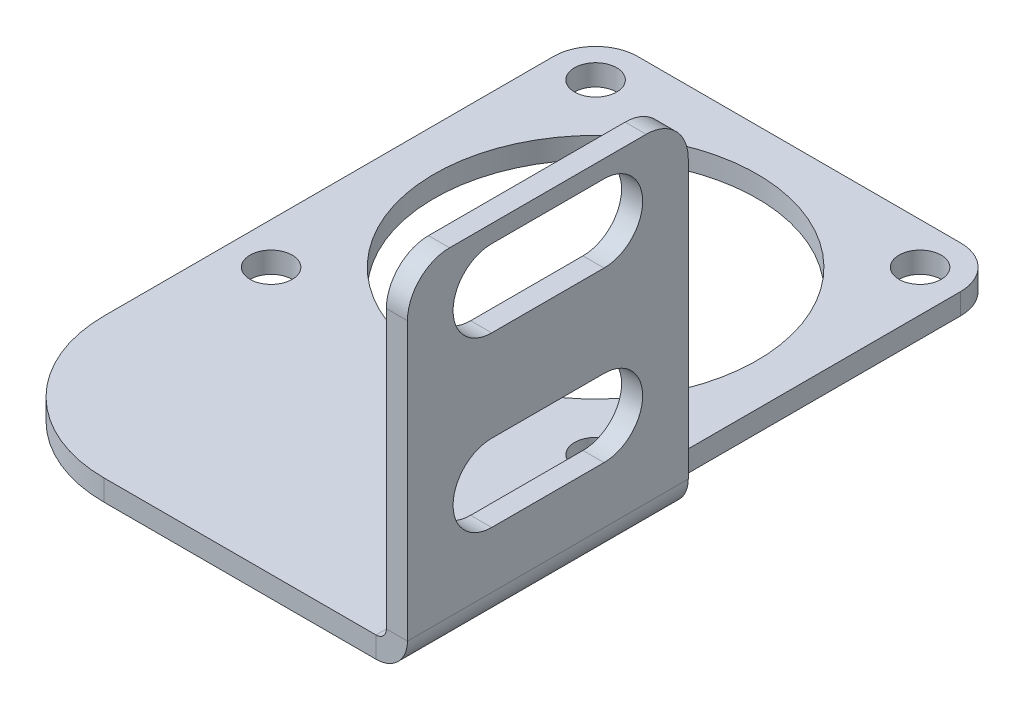
ISO-10303-21;
HEADER;
FILE_DESCRIPTION(('STEP AP214'),'2;1');
FILE_NAME('part.step','',(''),(''),'','','');
FILE_SCHEMA(('AUTOMOTIVE_DESIGN { 1 0 10303 214 1 1 1 1 }'));
ENDSEC;
DATA;
#1=APPLICATION_CONTEXT('core data for automotive mechanical design processes');
#2=APPLICATION_PROTOCOL_DEFINITION('international standard','automotive_design',2000,#1);
#3=PRODUCT_CONTEXT('',#1,'mechanical');
#4=PRODUCT('Part','Part','',(#3));
#5=PRODUCT_RELATED_PRODUCT_CATEGORY('part','',(#4));
#6=PRODUCT_DEFINITION_FORMATION('','',#4);
#7=PRODUCT_DEFINITION_CONTEXT('part definition',#1,'design');
#8=PRODUCT_DEFINITION('design','',#6,#7);
#9=PRODUCT_DEFINITION_SHAPE('','',#8);
#10=(LENGTH_UNIT() NAMED_UNIT(*) SI_UNIT(.MILLI.,.METRE.));
#11=(NAMED_UNIT(*) PLANE_ANGLE_UNIT() SI_UNIT($,.RADIAN.));
#12=(NAMED_UNIT(*) SI_UNIT($,.STERADIAN.) SOLID_ANGLE_UNIT());
#13=UNCERTAINTY_MEASURE_WITH_UNIT(LENGTH_MEASURE(1.E-05),#10,'distance_accuracy_value','');
#14=(GEOMETRIC_REPRESENTATION_CONTEXT(3) GLOBAL_UNCERTAINTY_ASSIGNED_CONTEXT((#13)) GLOBAL_UNIT_ASSIGNED_CONTEXT((#10,
#11,#12)) REPRESENTATION_CONTEXT('',''));
#15=CARTESIAN_POINT('',(0.,0.,0.));
#16=DIRECTION('',(0.,0.,1.));
#17=DIRECTION('',(1.,0.,0.));
#18=AXIS2_PLACEMENT_3D('',#15,#16,#17);
#19=CARTESIAN_POINT('',(-14.5,22.25,8.5));
#20=DIRECTION('',(0.,1.,0.));
#21=DIRECTION('',(1.,0.,0.));
#22=AXIS2_PLACEMENT_3D('',#19,#20,#21);
#23=PLANE('',#22);
#24=DIRECTION('',(0.,0.,-1.));
#25=VECTOR('',#24,1.);
#26=CARTESIAN_POINT('',(15.6,22.25,0.));
#27=LINE('',#26,#25);
#28=CARTESIAN_POINT('',(15.6,22.25,16.5));
#29=VERTEX_POINT('',#28);
#30=CARTESIAN_POINT('',(15.6,22.25,8.5));
#31=VERTEX_POINT('',#30);
#32=EDGE_CURVE('E114',#29,#31,#27,.T.);
#33=ORIENTED_EDGE('',*,*,#32,.T.);
#34=DIRECTION('',(1.,0.,0.));
#35=VECTOR('',#34,1.);
#36=CARTESIAN_POINT('',(-14.5,22.25,8.5));
#37=LINE('',#36,#35);
#38=CARTESIAN_POINT('',(17.1,22.25,8.5));
#39=VERTEX_POINT('',#38);
#40=EDGE_CURVE('E133',#31,#39,#37,.T.);
#41=ORIENTED_EDGE('',*,*,#40,.T.);
#42=DIRECTION('',(0.,0.,1.));
#43=VECTOR('',#42,1.);
#44=CARTESIAN_POINT('',(17.1,22.25,8.5));
#45=LINE('',#44,#43);
#46=CARTESIAN_POINT('',(17.1,22.25,16.5));
#47=VERTEX_POINT('',#46);
#48=EDGE_CURVE('E325',#39,#47,#45,.T.);
#49=ORIENTED_EDGE('',*,*,#48,.T.);
#50=DIRECTION('',(1.,0.,0.));
#51=VECTOR('',#50,1.);
#52=CARTESIAN_POINT('',(-14.5,22.25,16.5));
#53=LINE('',#52,#51);
#54=EDGE_CURVE('E11',#29,#47,#53,.T.);
#55=ORIENTED_EDGE('',*,*,#54,.F.);
#56=EDGE_LOOP('',(#33,#41,#49,#55));
#57=FACE_BOUND('',#56,.T.);
#58=ADVANCED_FACE('F17',(#57),#23,.F.);
#59=CARTESIAN_POINT('',(-14.5,19.5,16.5));
#60=DIRECTION('',(1.,0.,0.));
#61=DIRECTION('',(0.,1.,0.));
#62=AXIS2_PLACEMENT_3D('',#59,#60,#61);
#63=CYLINDRICAL_SURFACE('',#62,2.75);
#64=CARTESIAN_POINT('',(15.6,19.5,16.5));
#65=DIRECTION('',(-1.,0.,0.));
#66=DIRECTION('',(0.,-1.,0.));
#67=AXIS2_PLACEMENT_3D('',#64,#65,#66);
#68=CIRCLE('',#67,2.75);
#69=CARTESIAN_POINT('',(15.6,16.75,16.5));
#70=VERTEX_POINT('',#69);
#71=EDGE_CURVE('E111',#70,#29,#68,.T.);
#72=ORIENTED_EDGE('',*,*,#71,.T.);
#73=ORIENTED_EDGE('',*,*,#54,.T.);
#74=CARTESIAN_POINT('',(17.1,19.5,16.5));
#75=DIRECTION('',(1.,0.,0.));
#76=DIRECTION('',(0.,1.,0.));
#77=AXIS2_PLACEMENT_3D('',#74,#75,#76);
#78=CIRCLE('',#77,2.75);
#79=CARTESIAN_POINT('',(17.1,16.75,16.5));
#80=VERTEX_POINT('',#79);
#81=EDGE_CURVE('E205',#47,#80,#78,.T.);
#82=ORIENTED_EDGE('',*,*,#81,.T.);
#83=DIRECTION('',(1.,0.,0.));
#84=VECTOR('',#83,1.);
#85=CARTESIAN_POINT('',(-14.5,16.75,16.5));
#86=LINE('',#85,#84);
#87=EDGE_CURVE('E21',#70,#80,#86,.T.);
#88=ORIENTED_EDGE('',*,*,#87,.F.);
#89=EDGE_LOOP('',(#72,#73,#82,#88));
#90=FACE_BOUND('',#89,.T.);
#91=ADVANCED_FACE('F19',(#90),#63,.F.);
#92=CARTESIAN_POINT('',(-14.5,16.75,8.5));
#93=DIRECTION('',(0.,-1.,0.));
#94=DIRECTION('',(-1.,0.,0.));
#95=AXIS2_PLACEMENT_3D('',#92,#93,#94);
#96=PLANE('',#95);
#97=DIRECTION('',(0.,0.,1.));
#98=VECTOR('',#97,1.);
#99=CARTESIAN_POINT('',(15.6,16.75,0.));
#100=LINE('',#99,#98);
#101=CARTESIAN_POINT('',(15.6,16.75,8.5));
#102=VERTEX_POINT('',#101);
#103=EDGE_CURVE('E102',#102,#70,#100,.T.);
#104=ORIENTED_EDGE('',*,*,#103,.T.);
#105=ORIENTED_EDGE('',*,*,#87,.T.);
#106=DIRECTION('',(0.,0.,-1.));
#107=VECTOR('',#106,1.);
#108=CARTESIAN_POINT('',(17.1,16.75,8.5));
#109=LINE('',#108,#107);
#110=CARTESIAN_POINT('',(17.1,16.75,8.5));
#111=VERTEX_POINT('',#110);
#112=EDGE_CURVE('E202',#80,#111,#109,.T.);
#113=ORIENTED_EDGE('',*,*,#112,.T.);
#114=DIRECTION('',(1.,0.,0.));
#115=VECTOR('',#114,1.);
#116=CARTESIAN_POINT('',(-14.5,16.75,8.5));
#117=LINE('',#116,#115);
#118=EDGE_CURVE('E126',#102,#111,#117,.T.);
#119=ORIENTED_EDGE('',*,*,#118,.F.);
#120=EDGE_LOOP('',(#104,#105,#113,#119));
#121=FACE_BOUND('',#120,.T.);
#122=ADVANCED_FACE('F518',(#121),#96,.F.);
#123=CARTESIAN_POINT('',(-14.5,19.5,8.5));
#124=DIRECTION('',(1.,0.,0.));
#125=DIRECTION('',(0.,1.,0.));
#126=AXIS2_PLACEMENT_3D('',#123,#124,#125);
#127=CYLINDRICAL_SURFACE('',#126,2.75);
#128=CARTESIAN_POINT('',(15.6,19.5,8.5));
#129=DIRECTION('',(-1.,0.,0.));
#130=DIRECTION('',(0.,-1.,0.));
#131=AXIS2_PLACEMENT_3D('',#128,#129,#130);
#132=CIRCLE('',#131,2.75);
#133=EDGE_CURVE('E384',#31,#102,#132,.T.);
#134=ORIENTED_EDGE('',*,*,#133,.T.);
#135=ORIENTED_EDGE('',*,*,#118,.T.);
#136=CARTESIAN_POINT('',(17.1,19.5,8.5));
#137=DIRECTION('',(1.,0.,0.));
#138=DIRECTION('',(0.,1.,0.));
#139=AXIS2_PLACEMENT_3D('',#136,#137,#138);
#140=CIRCLE('',#139,2.75);
#141=EDGE_CURVE('E206',#111,#39,#140,.T.);
#142=ORIENTED_EDGE('',*,*,#141,.T.);
#143=ORIENTED_EDGE('',*,*,#40,.F.);
#144=EDGE_LOOP('',(#134,#135,#142,#143));
#145=FACE_BOUND('',#144,.T.);
#146=ADVANCED_FACE('F509',(#145),#127,.F.);
#147=CARTESIAN_POINT('',(-14.5,10.25,8.5));
#148=DIRECTION('',(0.,1.,0.));
#149=DIRECTION('',(1.,0.,0.));
#150=AXIS2_PLACEMENT_3D('',#147,#148,#149);
#151=PLANE('',#150);
#152=DIRECTION('',(0.,0.,-1.));
#153=VECTOR('',#152,1.);
#154=CARTESIAN_POINT('',(15.6,10.25,0.));
#155=LINE('',#154,#153);
#156=CARTESIAN_POINT('',(15.6,10.25,16.5));
#157=VERTEX_POINT('',#156);
#158=CARTESIAN_POINT('',(15.6,10.25,8.5));
#159=VERTEX_POINT('',#158);
#160=EDGE_CURVE('E101',#157,#159,#155,.T.);
#161=ORIENTED_EDGE('',*,*,#160,.T.);
#162=DIRECTION('',(1.,0.,0.));
#163=VECTOR('',#162,1.);
#164=CARTESIAN_POINT('',(-14.5,10.25,8.5));
#165=LINE('',#164,#163);
#166=CARTESIAN_POINT('',(17.1,10.25,8.5));
#167=VERTEX_POINT('',#166);
#168=EDGE_CURVE('E68',#159,#167,#165,.T.);
#169=ORIENTED_EDGE('',*,*,#168,.T.);
#170=DIRECTION('',(0.,0.,1.));
#171=VECTOR('',#170,1.);
#172=CARTESIAN_POINT('',(17.1,10.25,8.5));
#173=LINE('',#172,#171);
#174=CARTESIAN_POINT('',(17.1,10.25,16.5));
#175=VERTEX_POINT('',#174);
#176=EDGE_CURVE('E243',#167,#175,#173,.T.);
#177=ORIENTED_EDGE('',*,*,#176,.T.);
#178=DIRECTION('',(1.,0.,0.));
#179=VECTOR('',#178,1.);
#180=CARTESIAN_POINT('',(-14.5,10.25,16.5));
#181=LINE('',#180,#179);
#182=EDGE_CURVE('E123',#157,#175,#181,.T.);
#183=ORIENTED_EDGE('',*,*,#182,.F.);
#184=EDGE_LOOP('',(#161,#169,#177,#183));
#185=FACE_BOUND('',#184,.T.);
#186=ADVANCED_FACE('F693',(#185),#151,.F.);
#187=CARTESIAN_POINT('',(-14.5,7.5000000000001,16.5));
#188=DIRECTION('',(1.,0.,0.));
#189=DIRECTION('',(0.,1.,0.));
#190=AXIS2_PLACEMENT_3D('',#187,#188,#189);
#191=CYLINDRICAL_SURFACE('',#190,2.75);
#192=CARTESIAN_POINT('',(15.6,7.5,16.5));
#193=DIRECTION('',(-1.,0.,0.));
#194=DIRECTION('',(0.,-1.,0.));
#195=AXIS2_PLACEMENT_3D('',#192,#193,#194);
#196=CIRCLE('',#195,2.75);
#197=CARTESIAN_POINT('',(15.6,4.75,16.5));
#198=VERTEX_POINT('',#197);
#199=EDGE_CURVE('E95',#198,#157,#196,.T.);
#200=ORIENTED_EDGE('',*,*,#199,.T.);
#201=ORIENTED_EDGE('',*,*,#182,.T.);
#202=CARTESIAN_POINT('',(17.1,7.5,16.5));
#203=DIRECTION('',(1.,0.,0.));
#204=DIRECTION('',(0.,1.,0.));
#205=AXIS2_PLACEMENT_3D('',#202,#203,#204);
#206=CIRCLE('',#205,2.75);
#207=CARTESIAN_POINT('',(17.1,4.75,16.5));
#208=VERTEX_POINT('',#207);
#209=EDGE_CURVE('E215',#175,#208,#206,.T.);
#210=ORIENTED_EDGE('',*,*,#209,.T.);
#211=DIRECTION('',(1.,0.,0.));
#212=VECTOR('',#211,1.);
#213=CARTESIAN_POINT('',(-14.5,4.7500000000001,16.5));
#214=LINE('',#213,#212);
#215=EDGE_CURVE('E42',#198,#208,#214,.T.);
#216=ORIENTED_EDGE('',*,*,#215,.F.);
#217=EDGE_LOOP('',(#200,#201,#210,#216));
#218=FACE_BOUND('',#217,.T.);
#219=ADVANCED_FACE('F690',(#218),#191,.F.);
#220=CARTESIAN_POINT('',(-14.5,4.7500000000001,8.5));
#221=DIRECTION('',(0.,-1.,0.));
#222=DIRECTION('',(-1.,0.,0.));
#223=AXIS2_PLACEMENT_3D('',#220,#221,#222);
#224=PLANE('',#223);
#225=DIRECTION('',(0.,0.,1.));
#226=VECTOR('',#225,1.);
#227=CARTESIAN_POINT('',(15.6,4.75,0.));
#228=LINE('',#227,#226);
#229=CARTESIAN_POINT('',(15.6,4.75,8.5));
#230=VERTEX_POINT('',#229);
#231=EDGE_CURVE('E80',#230,#198,#228,.T.);
#232=ORIENTED_EDGE('',*,*,#231,.T.);
#233=ORIENTED_EDGE('',*,*,#215,.T.);
#234=DIRECTION('',(0.,0.,-1.));
#235=VECTOR('',#234,1.);
#236=CARTESIAN_POINT('',(17.1,4.75,8.5));
#237=LINE('',#236,#235);
#238=CARTESIAN_POINT('',(17.1,4.75,8.5));
#239=VERTEX_POINT('',#238);
#240=EDGE_CURVE('E84',#208,#239,#237,.T.);
#241=ORIENTED_EDGE('',*,*,#240,.T.);
#242=DIRECTION('',(1.,0.,0.));
#243=VECTOR('',#242,1.);
#244=CARTESIAN_POINT('',(-14.5,4.7500000000001,8.5));
#245=LINE('',#244,#243);
#246=EDGE_CURVE('E77',#230,#239,#245,.T.);
#247=ORIENTED_EDGE('',*,*,#246,.F.);
#248=EDGE_LOOP('',(#232,#233,#241,#247));
#249=FACE_BOUND('',#248,.T.);
#250=ADVANCED_FACE('F79',(#249),#224,.F.);
#251=CARTESIAN_POINT('',(-14.5,7.5000000000001,8.5));
#252=DIRECTION('',(1.,0.,0.));
#253=DIRECTION('',(0.,1.,0.));
#254=AXIS2_PLACEMENT_3D('',#251,#252,#253);
#255=CYLINDRICAL_SURFACE('',#254,2.75);
#256=CARTESIAN_POINT('',(15.6,7.5,8.5));
#257=DIRECTION('',(-1.,0.,0.));
#258=DIRECTION('',(0.,-1.,0.));
#259=AXIS2_PLACEMENT_3D('',#256,#257,#258);
#260=CIRCLE('',#259,2.75);
#261=EDGE_CURVE('E94',#159,#230,#260,.T.);
#262=ORIENTED_EDGE('',*,*,#261,.T.);
#263=ORIENTED_EDGE('',*,*,#246,.T.);
#264=CARTESIAN_POINT('',(17.1,7.5,8.5));
#265=DIRECTION('',(1.,0.,0.));
#266=DIRECTION('',(0.,1.,0.));
#267=AXIS2_PLACEMENT_3D('',#264,#265,#266);
#268=CIRCLE('',#267,2.75);
#269=EDGE_CURVE('E320',#239,#167,#268,.T.);
#270=ORIENTED_EDGE('',*,*,#269,.T.);
#271=ORIENTED_EDGE('',*,*,#168,.F.);
#272=EDGE_LOOP('',(#262,#263,#270,#271));
#273=FACE_BOUND('',#272,.T.);
#274=ADVANCED_FACE('F99',(#273),#255,.F.);
#275=CARTESIAN_POINT('',(17.1,20.5,19.5));
#276=DIRECTION('',(-1.,0.,0.));
#277=DIRECTION('',(0.,-1.,0.));
#278=AXIS2_PLACEMENT_3D('',#275,#276,#277);
#279=CYLINDRICAL_SURFACE('',#278,3.);
#280=CARTESIAN_POINT('',(17.1,20.5,19.5));
#281=DIRECTION('',(1.,0.,0.));
#282=DIRECTION('',(0.,-1.,0.));
#283=AXIS2_PLACEMENT_3D('',#280,#281,#282);
#284=CIRCLE('',#283,3.);
#285=CARTESIAN_POINT('',(17.1,23.5,19.5));
#286=VERTEX_POINT('',#285);
#287=CARTESIAN_POINT('',(17.1,20.5,22.5));
#288=VERTEX_POINT('',#287);
#289=EDGE_CURVE('E321',#286,#288,#284,.T.);
#290=ORIENTED_EDGE('',*,*,#289,.F.);
#291=DIRECTION('',(1.,0.,0.));
#292=VECTOR('',#291,1.);
#293=CARTESIAN_POINT('',(17.1,23.5,19.5));
#294=LINE('',#293,#292);
#295=CARTESIAN_POINT('',(15.6,23.5,19.5));
#296=VERTEX_POINT('',#295);
#297=EDGE_CURVE('E87',#296,#286,#294,.T.);
#298=ORIENTED_EDGE('',*,*,#297,.F.);
#299=CARTESIAN_POINT('',(15.6,20.5,19.5));
#300=DIRECTION('',(-1.,0.,0.));
#301=DIRECTION('',(0.,-1.,0.));
#302=AXIS2_PLACEMENT_3D('',#299,#300,#301);
#303=CIRCLE('',#302,3.);
#304=CARTESIAN_POINT('',(15.6,20.5,22.5));
#305=VERTEX_POINT('',#304);
#306=EDGE_CURVE('E381',#305,#296,#303,.T.);
#307=ORIENTED_EDGE('',*,*,#306,.F.);
#308=DIRECTION('',(-1.,0.,0.));
#309=VECTOR('',#308,1.);
#310=CARTESIAN_POINT('',(17.1,20.5,22.5));
#311=LINE('',#310,#309);
#312=EDGE_CURVE('E299',#288,#305,#311,.T.);
#313=ORIENTED_EDGE('',*,*,#312,.F.);
#314=EDGE_LOOP('',(#290,#298,#307,#313));
#315=FACE_BOUND('',#314,.T.);
#316=ADVANCED_FACE('F682',(#315),#279,.T.);
#317=CARTESIAN_POINT('',(17.1,20.5,5.5));
#318=DIRECTION('',(-1.,0.,0.));
#319=DIRECTION('',(0.,-1.,0.));
#320=AXIS2_PLACEMENT_3D('',#317,#318,#319);
#321=CYLINDRICAL_SURFACE('',#320,3.);
#322=CARTESIAN_POINT('',(17.1,20.5,5.5));
#323=DIRECTION('',(1.,0.,0.));
#324=DIRECTION('',(0.,-1.,0.));
#325=AXIS2_PLACEMENT_3D('',#322,#323,#324);
#326=CIRCLE('',#325,3.);
#327=CARTESIAN_POINT('',(17.1,20.5,2.5));
#328=VERTEX_POINT('',#327);
#329=CARTESIAN_POINT('',(17.1,23.5,5.5));
#330=VERTEX_POINT('',#329);
#331=EDGE_CURVE('E298',#328,#330,#326,.T.);
#332=ORIENTED_EDGE('',*,*,#331,.F.);
#333=DIRECTION('',(1.,0.,0.));
#334=VECTOR('',#333,1.);
#335=CARTESIAN_POINT('',(17.1,20.5,2.5));
#336=LINE('',#335,#334);
#337=CARTESIAN_POINT('',(15.6,20.5,2.5));
#338=VERTEX_POINT('',#337);
#339=EDGE_CURVE('E275',#338,#328,#336,.T.);
#340=ORIENTED_EDGE('',*,*,#339,.F.);
#341=CARTESIAN_POINT('',(15.6,20.5,5.5));
#342=DIRECTION('',(-1.,0.,0.));
#343=DIRECTION('',(0.,-1.,0.));
#344=AXIS2_PLACEMENT_3D('',#341,#342,#343);
#345=CIRCLE('',#344,3.);
#346=CARTESIAN_POINT('',(15.6,23.5,5.5));
#347=VERTEX_POINT('',#346);
#348=EDGE_CURVE('E378',#347,#338,#345,.T.);
#349=ORIENTED_EDGE('',*,*,#348,.F.);
#350=DIRECTION('',(-1.,0.,0.));
#351=VECTOR('',#350,1.);
#352=CARTESIAN_POINT('',(17.1,23.5,5.5));
#353=LINE('',#352,#351);
#354=EDGE_CURVE('E97',#330,#347,#353,.T.);
#355=ORIENTED_EDGE('',*,*,#354,.F.);
#356=EDGE_LOOP('',(#332,#340,#349,#355));
#357=FACE_BOUND('',#356,.T.);
#358=ADVANCED_FACE('F678',(#357),#321,.T.);
#359=CARTESIAN_POINT('',(-11.5,-1.5,-19.5));
#360=DIRECTION('',(0.,1.,0.));
#361=DIRECTION('',(0.,0.,1.));
#362=AXIS2_PLACEMENT_3D('',#359,#360,#361);
#363=CYLINDRICAL_SURFACE('',#362,3.);
#364=CARTESIAN_POINT('',(-11.5,-1.5,-19.5));
#365=DIRECTION('',(0.,-1.,0.));
#366=DIRECTION('',(0.,0.,1.));
#367=AXIS2_PLACEMENT_3D('',#364,#365,#366);
#368=CIRCLE('',#367,3.);
#369=CARTESIAN_POINT('',(-14.5,-1.5,-19.5));
#370=VERTEX_POINT('',#369);
#371=CARTESIAN_POINT('',(-11.5,-1.5,-22.5));
#372=VERTEX_POINT('',#371);
#373=EDGE_CURVE('E159',#370,#372,#368,.T.);
#374=ORIENTED_EDGE('',*,*,#373,.F.);
#375=DIRECTION('',(0.,-1.,0.));
#376=VECTOR('',#375,1.);
#377=CARTESIAN_POINT('',(-14.5,-1.5,-19.5));
#378=LINE('',#377,#376);
#379=CARTESIAN_POINT('',(-14.5,0.,-19.5));
#380=VERTEX_POINT('',#379);
#381=EDGE_CURVE('E279',#380,#370,#378,.T.);
#382=ORIENTED_EDGE('',*,*,#381,.F.);
#383=CARTESIAN_POINT('',(-11.5,0.,-19.5));
#384=DIRECTION('',(0.,1.,0.));
#385=DIRECTION('',(0.,0.,1.));
#386=AXIS2_PLACEMENT_3D('',#383,#384,#385);
#387=CIRCLE('',#386,3.);
#388=CARTESIAN_POINT('',(-11.5,0.,-22.5));
#389=VERTEX_POINT('',#388);
#390=EDGE_CURVE('E201',#389,#380,#387,.T.);
#391=ORIENTED_EDGE('',*,*,#390,.F.);
#392=DIRECTION('',(0.,1.,0.));
#393=VECTOR('',#392,1.);
#394=CARTESIAN_POINT('',(-11.5,-1.5,-22.5));
#395=LINE('',#394,#393);
#396=EDGE_CURVE('E179',#372,#389,#395,.T.);
#397=ORIENTED_EDGE('',*,*,#396,.F.);
#398=EDGE_LOOP('',(#374,#382,#391,#397));
#399=FACE_BOUND('',#398,.T.);
#400=ADVANCED_FACE('F674',(#399),#363,.T.);
#401=CARTESIAN_POINT('',(11.5,-1.5,-19.5));
#402=DIRECTION('',(0.,1.,0.));
#403=DIRECTION('',(0.,0.,1.));
#404=AXIS2_PLACEMENT_3D('',#401,#402,#403);
#405=CYLINDRICAL_SURFACE('',#404,3.);
#406=CARTESIAN_POINT('',(11.5,-1.5,-19.5));
#407=DIRECTION('',(0.,-1.,0.));
#408=DIRECTION('',(0.,0.,1.));
#409=AXIS2_PLACEMENT_3D('',#406,#407,#408);
#410=CIRCLE('',#409,3.);
#411=CARTESIAN_POINT('',(11.5,-1.5,-22.5));
#412=VERTEX_POINT('',#411);
#413=CARTESIAN_POINT('',(14.5,-1.5,-19.5));
#414=VERTEX_POINT('',#413);
#415=EDGE_CURVE('E406',#412,#414,#410,.T.);
#416=ORIENTED_EDGE('',*,*,#415,.F.);
#417=DIRECTION('',(0.,-1.,0.));
#418=VECTOR('',#417,1.);
#419=CARTESIAN_POINT('',(11.5,-1.5,-22.5));
#420=LINE('',#419,#418);
#421=CARTESIAN_POINT('',(11.5,0.,-22.5));
#422=VERTEX_POINT('',#421);
#423=EDGE_CURVE('E286',#422,#412,#420,.T.);
#424=ORIENTED_EDGE('',*,*,#423,.F.);
#425=CARTESIAN_POINT('',(11.5,0.,-19.5));
#426=DIRECTION('',(0.,1.,0.));
#427=DIRECTION('',(0.,0.,1.));
#428=AXIS2_PLACEMENT_3D('',#425,#426,#427);
#429=CIRCLE('',#428,3.);
#430=CARTESIAN_POINT('',(14.5,0.,-19.5));
#431=VERTEX_POINT('',#430);
#432=EDGE_CURVE('E168',#431,#422,#429,.T.);
#433=ORIENTED_EDGE('',*,*,#432,.F.);
#434=DIRECTION('',(0.,1.,0.));
#435=VECTOR('',#434,1.);
#436=CARTESIAN_POINT('',(14.5,-1.5,-19.5));
#437=LINE('',#436,#435);
#438=EDGE_CURVE('E174',#414,#431,#437,.T.);
#439=ORIENTED_EDGE('',*,*,#438,.F.);
#440=EDGE_LOOP('',(#416,#424,#433,#439));
#441=FACE_BOUND('',#440,.T.);
#442=ADVANCED_FACE('F670',(#441),#405,.T.);
#443=CARTESIAN_POINT('',(-4.5,-1.5,12.5));
#444=DIRECTION('',(0.,1.,0.));
#445=DIRECTION('',(0.,0.,1.));
#446=AXIS2_PLACEMENT_3D('',#443,#444,#445);
#447=CYLINDRICAL_SURFACE('',#446,10.);
#448=CARTESIAN_POINT('',(-4.5,-1.5,12.5));
#449=DIRECTION('',(0.,-1.,0.));
#450=DIRECTION('',(0.,0.,1.));
#451=AXIS2_PLACEMENT_3D('',#448,#449,#450);
#452=CIRCLE('',#451,10.);
#453=CARTESIAN_POINT('',(-4.5,-1.5,22.5));
#454=VERTEX_POINT('',#453);
#455=CARTESIAN_POINT('',(-14.5,-1.5,12.5));
#456=VERTEX_POINT('',#455);
#457=EDGE_CURVE('E153',#454,#456,#452,.T.);
#458=ORIENTED_EDGE('',*,*,#457,.F.);
#459=DIRECTION('',(0.,-1.,0.));
#460=VECTOR('',#459,1.);
#461=CARTESIAN_POINT('',(-4.5,-1.5,22.5));
#462=LINE('',#461,#460);
#463=CARTESIAN_POINT('',(-4.5,0.,22.5));
#464=VERTEX_POINT('',#463);
#465=EDGE_CURVE('E178',#464,#454,#462,.T.);
#466=ORIENTED_EDGE('',*,*,#465,.F.);
#467=CARTESIAN_POINT('',(-4.5,0.,12.5));
#468=DIRECTION('',(0.,1.,0.));
#469=DIRECTION('',(0.,0.,1.));
#470=AXIS2_PLACEMENT_3D('',#467,#468,#469);
#471=CIRCLE('',#470,10.);
#472=CARTESIAN_POINT('',(-14.5,0.,12.5));
#473=VERTEX_POINT('',#472);
#474=EDGE_CURVE('E214',#473,#464,#471,.T.);
#475=ORIENTED_EDGE('',*,*,#474,.F.);
#476=DIRECTION('',(0.,1.,0.));
#477=VECTOR('',#476,1.);
#478=CARTESIAN_POINT('',(-14.5,-1.5,12.5));
#479=LINE('',#478,#477);
#480=EDGE_CURVE('E283',#456,#473,#479,.T.);
#481=ORIENTED_EDGE('',*,*,#480,.F.);
#482=EDGE_LOOP('',(#458,#466,#475,#481));
#483=FACE_BOUND('',#482,.T.);
#484=ADVANCED_FACE('F666',(#483),#447,.T.);
#485=CARTESIAN_POINT('',(17.1,23.5,22.5));
#486=DIRECTION('',(0.,-1.,0.));
#487=DIRECTION('',(-1.,0.,0.));
#488=AXIS2_PLACEMENT_3D('',#485,#486,#487);
#489=PLANE('',#488);
#490=DIRECTION('',(0.,0.,1.));
#491=VECTOR('',#490,1.);
#492=CARTESIAN_POINT('',(17.1,23.5,0.));
#493=LINE('',#492,#491);
#494=EDGE_CURVE('E326',#330,#286,#493,.T.);
#495=ORIENTED_EDGE('',*,*,#494,.F.);
#496=ORIENTED_EDGE('',*,*,#354,.T.);
#497=DIRECTION('',(0.,0.,1.));
#498=VECTOR('',#497,1.);
#499=CARTESIAN_POINT('',(15.6,23.5,22.5));
#500=LINE('',#499,#498);
#501=EDGE_CURVE('E218',#347,#296,#500,.T.);
#502=ORIENTED_EDGE('',*,*,#501,.T.);
#503=ORIENTED_EDGE('',*,*,#297,.T.);
#504=EDGE_LOOP('',(#495,#496,#502,#503));
#505=FACE_BOUND('',#504,.T.);
#506=ADVANCED_FACE('F663',(#505),#489,.F.);
#507=CARTESIAN_POINT('',(15.6,0.,0.));
#508=DIRECTION('',(-1.,0.,0.));
#509=DIRECTION('',(0.,0.,1.));
#510=AXIS2_PLACEMENT_3D('',#507,#508,#509);
#511=PLANE('',#510);
#512=ORIENTED_EDGE('',*,*,#261,.F.);
#513=ORIENTED_EDGE('',*,*,#160,.F.);
#514=ORIENTED_EDGE('',*,*,#199,.F.);
#515=ORIENTED_EDGE('',*,*,#231,.F.);
#516=EDGE_LOOP('',(#512,#513,#514,#515));
#517=FACE_BOUND('',#516,.T.);
#518=ORIENTED_EDGE('',*,*,#133,.F.);
#519=ORIENTED_EDGE('',*,*,#32,.F.);
#520=ORIENTED_EDGE('',*,*,#71,.F.);
#521=ORIENTED_EDGE('',*,*,#103,.F.);
#522=EDGE_LOOP('',(#518,#519,#520,#521));
#523=FACE_BOUND('',#522,.T.);
#524=ORIENTED_EDGE('',*,*,#501,.F.);
#525=ORIENTED_EDGE('',*,*,#348,.T.);
#526=DIRECTION('',(0.,1.,0.));
#527=VECTOR('',#526,1.);
#528=CARTESIAN_POINT('',(15.6,23.5,2.5));
#529=LINE('',#528,#527);
#530=CARTESIAN_POINT('',(15.6,0.7366,2.5));
#531=VERTEX_POINT('',#530);
#532=EDGE_CURVE('E349',#531,#338,#529,.T.);
#533=ORIENTED_EDGE('',*,*,#532,.F.);
#534=DIRECTION('',(0.,0.,-1.));
#535=VECTOR('',#534,1.);
#536=CARTESIAN_POINT('',(15.6,0.7366,22.5));
#537=LINE('',#536,#535);
#538=CARTESIAN_POINT('',(15.6,0.7366,22.5));
#539=VERTEX_POINT('',#538);
#540=EDGE_CURVE('E345',#539,#531,#537,.T.);
#541=ORIENTED_EDGE('',*,*,#540,.F.);
#542=DIRECTION('',(0.,-1.,0.));
#543=VECTOR('',#542,1.);
#544=CARTESIAN_POINT('',(15.6,0.,22.5));
#545=LINE('',#544,#543);
#546=EDGE_CURVE('E294',#305,#539,#545,.T.);
#547=ORIENTED_EDGE('',*,*,#546,.F.);
#548=ORIENTED_EDGE('',*,*,#306,.T.);
#549=EDGE_LOOP('',(#524,#525,#533,#541,#547,#548));
#550=FACE_BOUND('',#549,.T.);
#551=ADVANCED_FACE('F91',(#517,#523,#550),#511,.T.);
#552=CARTESIAN_POINT('',(17.1,0.,0.));
#553=DIRECTION('',(-1.,0.,0.));
#554=DIRECTION('',(0.,0.,1.));
#555=AXIS2_PLACEMENT_3D('',#552,#553,#554);
#556=PLANE('',#555);
#557=ORIENTED_EDGE('',*,*,#176,.F.);
#558=ORIENTED_EDGE('',*,*,#269,.F.);
#559=ORIENTED_EDGE('',*,*,#240,.F.);
#560=ORIENTED_EDGE('',*,*,#209,.F.);
#561=EDGE_LOOP('',(#557,#558,#559,#560));
#562=FACE_BOUND('',#561,.T.);
#563=ORIENTED_EDGE('',*,*,#48,.F.);
#564=ORIENTED_EDGE('',*,*,#141,.F.);
#565=ORIENTED_EDGE('',*,*,#112,.F.);
#566=ORIENTED_EDGE('',*,*,#81,.F.);
#567=EDGE_LOOP('',(#563,#564,#565,#566));
#568=FACE_BOUND('',#567,.T.);
#569=DIRECTION('',(0.,1.,0.));
#570=VECTOR('',#569,1.);
#571=CARTESIAN_POINT('',(17.1,0.,2.5));
#572=LINE('',#571,#570);
#573=CARTESIAN_POINT('',(17.1,0.736599999999992,2.5));
#574=VERTEX_POINT('',#573);
#575=EDGE_CURVE('E270',#574,#328,#572,.T.);
#576=ORIENTED_EDGE('',*,*,#575,.T.);
#577=ORIENTED_EDGE('',*,*,#331,.T.);
#578=ORIENTED_EDGE('',*,*,#494,.T.);
#579=ORIENTED_EDGE('',*,*,#289,.T.);
#580=DIRECTION('',(0.,-1.,0.));
#581=VECTOR('',#580,1.);
#582=CARTESIAN_POINT('',(17.1,0.,22.5));
#583=LINE('',#582,#581);
#584=CARTESIAN_POINT('',(17.1,0.736599999999992,22.5));
#585=VERTEX_POINT('',#584);
#586=EDGE_CURVE('E274',#288,#585,#583,.T.);
#587=ORIENTED_EDGE('',*,*,#586,.T.);
#588=DIRECTION('',(0.,0.,1.));
#589=VECTOR('',#588,1.);
#590=CARTESIAN_POINT('',(17.1,0.736599999999992,22.5));
#591=LINE('',#590,#589);
#592=EDGE_CURVE('E341',#574,#585,#591,.T.);
#593=ORIENTED_EDGE('',*,*,#592,.F.);
#594=EDGE_LOOP('',(#576,#577,#578,#579,#587,#593));
#595=FACE_BOUND('',#594,.T.);
#596=ADVANCED_FACE('F522',(#562,#568,#595),#556,.F.);
#597=CARTESIAN_POINT('',(17.1,0.,22.5));
#598=DIRECTION('',(0.,0.,-1.));
#599=DIRECTION('',(0.,-1.,0.));
#600=AXIS2_PLACEMENT_3D('',#597,#598,#599);
#601=PLANE('',#600);
#602=ORIENTED_EDGE('',*,*,#586,.F.);
#603=ORIENTED_EDGE('',*,*,#312,.T.);
#604=ORIENTED_EDGE('',*,*,#546,.T.);
#605=DIRECTION('',(1.,0.,0.));
#606=VECTOR('',#605,1.);
#607=CARTESIAN_POINT('',(17.1,0.736599999999992,22.5));
#608=LINE('',#607,#606);
#609=EDGE_CURVE('E227',#539,#585,#608,.T.);
#610=ORIENTED_EDGE('',*,*,#609,.T.);
#611=EDGE_LOOP('',(#602,#603,#604,#610));
#612=FACE_BOUND('',#611,.T.);
#613=ADVANCED_FACE('F456',(#612),#601,.F.);
#614=CARTESIAN_POINT('',(17.1,23.5,2.5));
#615=DIRECTION('',(0.,0.,1.));
#616=DIRECTION('',(0.,-1.,0.));
#617=AXIS2_PLACEMENT_3D('',#614,#615,#616);
#618=PLANE('',#617);
#619=ORIENTED_EDGE('',*,*,#532,.T.);
#620=ORIENTED_EDGE('',*,*,#339,.T.);
#621=ORIENTED_EDGE('',*,*,#575,.F.);
#622=DIRECTION('',(1.,0.,0.));
#623=VECTOR('',#622,1.);
#624=CARTESIAN_POINT('',(15.6,0.7366,2.5));
#625=LINE('',#624,#623);
#626=EDGE_CURVE('E330',#531,#574,#625,.T.);
#627=ORIENTED_EDGE('',*,*,#626,.F.);
#628=EDGE_LOOP('',(#619,#620,#621,#627));
#629=FACE_BOUND('',#628,.T.);
#630=ADVANCED_FACE('F424',(#629),#618,.F.);
#631=CARTESIAN_POINT('',(14.8634,0.7366,2.5));
#632=DIRECTION('',(0.,0.,-1.));
#633=DIRECTION('',(1.,0.,0.));
#634=AXIS2_PLACEMENT_3D('',#631,#632,#633);
#635=CYLINDRICAL_SURFACE('',#634,0.7366);
#636=DIRECTION('',(0.,0.,1.));
#637=VECTOR('',#636,1.);
#638=CARTESIAN_POINT('',(14.8634,0.,2.5));
#639=LINE('',#638,#637);
#640=CARTESIAN_POINT('',(14.8634,0.,2.5));
#641=VERTEX_POINT('',#640);
#642=CARTESIAN_POINT('',(14.8634,0.,22.5));
#643=VERTEX_POINT('',#642);
#644=EDGE_CURVE('E231',#641,#643,#639,.T.);
#645=ORIENTED_EDGE('',*,*,#644,.T.);
#646=CARTESIAN_POINT('',(14.8634,0.7366,22.5));
#647=DIRECTION('',(0.,0.,1.));
#648=DIRECTION('',(-1.,0.,0.));
#649=AXIS2_PLACEMENT_3D('',#646,#647,#648);
#650=CIRCLE('',#649,0.7366);
#651=EDGE_CURVE('E309',#643,#539,#650,.T.);
#652=ORIENTED_EDGE('',*,*,#651,.T.);
#653=ORIENTED_EDGE('',*,*,#540,.T.);
#654=CARTESIAN_POINT('',(14.8634,0.7366,2.5));
#655=DIRECTION('',(0.,0.,-1.));
#656=DIRECTION('',(-1.,0.,0.));
#657=AXIS2_PLACEMENT_3D('',#654,#655,#656);
#658=CIRCLE('',#657,0.7366);
#659=EDGE_CURVE('E317',#531,#641,#658,.T.);
#660=ORIENTED_EDGE('',*,*,#659,.T.);
#661=EDGE_LOOP('',(#645,#652,#653,#660));
#662=FACE_BOUND('',#661,.T.);
#663=ADVANCED_FACE('F440',(#662),#635,.F.);
#664=CARTESIAN_POINT('',(14.8634,0.7366,2.5));
#665=DIRECTION('',(0.,0.,-1.));
#666=DIRECTION('',(1.,0.,0.));
#667=AXIS2_PLACEMENT_3D('',#664,#665,#666);
#668=CYLINDRICAL_SURFACE('',#667,2.2366);
#669=DIRECTION('',(0.,0.,1.));
#670=VECTOR('',#669,1.);
#671=CARTESIAN_POINT('',(14.8634,-1.5,2.5));
#672=LINE('',#671,#670);
#673=CARTESIAN_POINT('',(14.8634,-1.5,2.5));
#674=VERTEX_POINT('',#673);
#675=CARTESIAN_POINT('',(14.8634,-1.5,22.5));
#676=VERTEX_POINT('',#675);
#677=EDGE_CURVE('E154',#674,#676,#672,.T.);
#678=ORIENTED_EDGE('',*,*,#677,.F.);
#679=CARTESIAN_POINT('',(14.8634,0.7366,2.5));
#680=DIRECTION('',(0.,0.,-1.));
#681=DIRECTION('',(-1.,0.,0.));
#682=AXIS2_PLACEMENT_3D('',#679,#680,#681);
#683=CIRCLE('',#682,2.2366);
#684=EDGE_CURVE('E334',#574,#674,#683,.T.);
#685=ORIENTED_EDGE('',*,*,#684,.F.);
#686=ORIENTED_EDGE('',*,*,#592,.T.);
#687=CARTESIAN_POINT('',(14.8634,0.7366,22.5));
#688=DIRECTION('',(0.,0.,1.));
#689=DIRECTION('',(-1.,0.,0.));
#690=AXIS2_PLACEMENT_3D('',#687,#688,#689);
#691=CIRCLE('',#690,2.2366);
#692=EDGE_CURVE('E313',#676,#585,#691,.T.);
#693=ORIENTED_EDGE('',*,*,#692,.F.);
#694=EDGE_LOOP('',(#678,#685,#686,#693));
#695=FACE_BOUND('',#694,.T.);
#696=ADVANCED_FACE('F794',(#695),#668,.T.);
#697=CARTESIAN_POINT('',(14.8634,0.7366,2.5));
#698=DIRECTION('',(0.,0.,1.));
#699=DIRECTION('',(1.,0.,0.));
#700=AXIS2_PLACEMENT_3D('',#697,#698,#699);
#701=PLANE('',#700);
#702=ORIENTED_EDGE('',*,*,#659,.F.);
#703=ORIENTED_EDGE('',*,*,#626,.T.);
#704=ORIENTED_EDGE('',*,*,#684,.T.);
#705=DIRECTION('',(0.,-1.,0.));
#706=VECTOR('',#705,1.);
#707=CARTESIAN_POINT('',(14.8634,0.,2.5));
#708=LINE('',#707,#706);
#709=EDGE_CURVE('E265',#641,#674,#708,.T.);
#710=ORIENTED_EDGE('',*,*,#709,.F.);
#711=EDGE_LOOP('',(#702,#703,#704,#710));
#712=FACE_BOUND('',#711,.T.);
#713=ADVANCED_FACE('F802',(#712),#701,.F.);
#714=CARTESIAN_POINT('',(14.8634,0.7366,22.5));
#715=DIRECTION('',(0.,0.,1.));
#716=DIRECTION('',(1.,0.,0.));
#717=AXIS2_PLACEMENT_3D('',#714,#715,#716);
#718=PLANE('',#717);
#719=ORIENTED_EDGE('',*,*,#609,.F.);
#720=ORIENTED_EDGE('',*,*,#651,.F.);
#721=DIRECTION('',(0.,-1.,0.));
#722=VECTOR('',#721,1.);
#723=CARTESIAN_POINT('',(14.8634,0.,22.5));
#724=LINE('',#723,#722);
#725=EDGE_CURVE('E223',#643,#676,#724,.T.);
#726=ORIENTED_EDGE('',*,*,#725,.T.);
#727=ORIENTED_EDGE('',*,*,#692,.T.);
#728=EDGE_LOOP('',(#719,#720,#726,#727));
#729=FACE_BOUND('',#728,.T.);
#730=ADVANCED_FACE('F452',(#729),#718,.T.);
#731=CARTESIAN_POINT('',(0.,-1.5,-8.));
#732=DIRECTION('',(0.,1.,0.));
#733=DIRECTION('',(0.,0.,1.));
#734=AXIS2_PLACEMENT_3D('',#731,#732,#733);
#735=CYLINDRICAL_SURFACE('',#734,11.5);
#736=CARTESIAN_POINT('',(0.,-1.5,-8.));
#737=DIRECTION('',(0.,1.,0.));
#738=DIRECTION('',(0.,0.,1.));
#739=AXIS2_PLACEMENT_3D('',#736,#737,#738);
#740=CIRCLE('',#739,11.5);
#741=CARTESIAN_POINT('',(0.,-1.5,3.5));
#742=VERTEX_POINT('',#741);
#743=EDGE_CURVE('E169',#742,#742,#740,.T.);
#744=ORIENTED_EDGE('',*,*,#743,.F.);
#745=EDGE_LOOP('',(#744));
#746=FACE_BOUND('',#745,.T.);
#747=CARTESIAN_POINT('',(0.,0.,-8.));
#748=DIRECTION('',(0.,1.,0.));
#749=DIRECTION('',(0.,0.,1.));
#750=AXIS2_PLACEMENT_3D('',#747,#748,#749);
#751=CIRCLE('',#750,11.5);
#752=CARTESIAN_POINT('',(0.,0.,3.5));
#753=VERTEX_POINT('',#752);
#754=EDGE_CURVE('E239',#753,#753,#751,.T.);
#755=ORIENTED_EDGE('',*,*,#754,.T.);
#756=EDGE_LOOP('',(#755));
#757=FACE_BOUND('',#756,.T.);
#758=ADVANCED_FACE('F818',(#746,#757),#735,.F.);
#759=CARTESIAN_POINT('',(11.555,-1.5,3.555));
#760=DIRECTION('',(0.,1.,0.));
#761=DIRECTION('',(0.,0.,1.));
#762=AXIS2_PLACEMENT_3D('',#759,#760,#761);
#763=CYLINDRICAL_SURFACE('',#762,1.5);
#764=CARTESIAN_POINT('',(11.555,-1.5,3.555));
#765=DIRECTION('',(0.,1.,0.));
#766=DIRECTION('',(0.,0.,1.));
#767=AXIS2_PLACEMENT_3D('',#764,#765,#766);
#768=CIRCLE('',#767,1.5);
#769=CARTESIAN_POINT('',(11.555,-1.5,5.055));
#770=VERTEX_POINT('',#769);
#771=EDGE_CURVE('E187',#770,#770,#768,.T.);
#772=ORIENTED_EDGE('',*,*,#771,.F.);
#773=EDGE_LOOP('',(#772));
#774=FACE_BOUND('',#773,.T.);
#775=CARTESIAN_POINT('',(11.555,0.,3.555));
#776=DIRECTION('',(0.,1.,0.));
#777=DIRECTION('',(0.,0.,1.));
#778=AXIS2_PLACEMENT_3D('',#775,#776,#777);
#779=CIRCLE('',#778,1.5);
#780=CARTESIAN_POINT('',(11.555,0.,5.055));
#781=VERTEX_POINT('',#780);
#782=EDGE_CURVE('E247',#781,#781,#779,.T.);
#783=ORIENTED_EDGE('',*,*,#782,.T.);
#784=EDGE_LOOP('',(#783));
#785=FACE_BOUND('',#784,.T.);
#786=ADVANCED_FACE('F647',(#774,#785),#763,.F.);
#787=CARTESIAN_POINT('',(-11.555,-1.5,3.555));
#788=DIRECTION('',(0.,1.,0.));
#789=DIRECTION('',(0.,0.,1.));
#790=AXIS2_PLACEMENT_3D('',#787,#788,#789);
#791=CYLINDRICAL_SURFACE('',#790,1.5);
#792=CARTESIAN_POINT('',(-11.555,-1.5,3.555));
#793=DIRECTION('',(0.,1.,0.));
#794=DIRECTION('',(0.,0.,1.));
#795=AXIS2_PLACEMENT_3D('',#792,#793,#794);
#796=CIRCLE('',#795,1.5);
#797=CARTESIAN_POINT('',(-11.555,-1.5,5.055));
#798=VERTEX_POINT('',#797);
#799=EDGE_CURVE('E183',#798,#798,#796,.T.);
#800=ORIENTED_EDGE('',*,*,#799,.F.);
#801=EDGE_LOOP('',(#800));
#802=FACE_BOUND('',#801,.T.);
#803=CARTESIAN_POINT('',(-11.555,0.,3.555));
#804=DIRECTION('',(0.,1.,0.));
#805=DIRECTION('',(0.,0.,1.));
#806=AXIS2_PLACEMENT_3D('',#803,#804,#805);
#807=CIRCLE('',#806,1.5);
#808=CARTESIAN_POINT('',(-11.555,0.,5.055));
#809=VERTEX_POINT('',#808);
#810=EDGE_CURVE('E253',#809,#809,#807,.T.);
#811=ORIENTED_EDGE('',*,*,#810,.T.);
#812=EDGE_LOOP('',(#811));
#813=FACE_BOUND('',#812,.T.);
#814=ADVANCED_FACE('F636',(#802,#813),#791,.F.);
#815=CARTESIAN_POINT('',(11.555,-1.5,-19.555));
#816=DIRECTION('',(0.,1.,0.));
#817=DIRECTION('',(0.,0.,1.));
#818=AXIS2_PLACEMENT_3D('',#815,#816,#817);
#819=CYLINDRICAL_SURFACE('',#818,1.5);
#820=CARTESIAN_POINT('',(11.555,-1.5,-19.555));
#821=DIRECTION('',(0.,1.,0.));
#822=DIRECTION('',(0.,0.,1.));
#823=AXIS2_PLACEMENT_3D('',#820,#821,#822);
#824=CIRCLE('',#823,1.5);
#825=CARTESIAN_POINT('',(11.555,-1.5,-18.055));
#826=VERTEX_POINT('',#825);
#827=EDGE_CURVE('E173',#826,#826,#824,.T.);
#828=ORIENTED_EDGE('',*,*,#827,.F.);
#829=EDGE_LOOP('',(#828));
#830=FACE_BOUND('',#829,.T.);
#831=CARTESIAN_POINT('',(11.555,0.,-19.555));
#832=DIRECTION('',(0.,1.,0.));
#833=DIRECTION('',(0.,0.,1.));
#834=AXIS2_PLACEMENT_3D('',#831,#832,#833);
#835=CIRCLE('',#834,1.5);
#836=CARTESIAN_POINT('',(11.555,0.,-18.055));
#837=VERTEX_POINT('',#836);
#838=EDGE_CURVE('E257',#837,#837,#835,.T.);
#839=ORIENTED_EDGE('',*,*,#838,.T.);
#840=EDGE_LOOP('',(#839));
#841=FACE_BOUND('',#840,.T.);
#842=ADVANCED_FACE('F633',(#830,#841),#819,.F.);
#843=CARTESIAN_POINT('',(-11.555,-1.5,-19.555));
#844=DIRECTION('',(0.,1.,0.));
#845=DIRECTION('',(0.,0.,1.));
#846=AXIS2_PLACEMENT_3D('',#843,#844,#845);
#847=CYLINDRICAL_SURFACE('',#846,1.5);
#848=CARTESIAN_POINT('',(-11.555,-1.5,-19.555));
#849=DIRECTION('',(0.,1.,0.));
#850=DIRECTION('',(0.,0.,1.));
#851=AXIS2_PLACEMENT_3D('',#848,#849,#850);
#852=CIRCLE('',#851,1.5);
#853=CARTESIAN_POINT('',(-11.555,-1.5,-18.055));
#854=VERTEX_POINT('',#853);
#855=EDGE_CURVE('E162',#854,#854,#852,.T.);
#856=ORIENTED_EDGE('',*,*,#855,.F.);
#857=EDGE_LOOP('',(#856));
#858=FACE_BOUND('',#857,.T.);
#859=CARTESIAN_POINT('',(-11.555,0.,-19.555));
#860=DIRECTION('',(0.,1.,0.));
#861=DIRECTION('',(0.,0.,1.));
#862=AXIS2_PLACEMENT_3D('',#859,#860,#861);
#863=CIRCLE('',#862,1.5);
#864=CARTESIAN_POINT('',(-11.555,0.,-18.055));
#865=VERTEX_POINT('',#864);
#866=EDGE_CURVE('E261',#865,#865,#863,.T.);
#867=ORIENTED_EDGE('',*,*,#866,.T.);
#868=EDGE_LOOP('',(#867));
#869=FACE_BOUND('',#868,.T.);
#870=ADVANCED_FACE('F635',(#858,#869),#847,.F.);
#871=CARTESIAN_POINT('',(14.5,-1.5,22.5));
#872=DIRECTION('',(0.,0.,1.));
#873=DIRECTION('',(1.,0.,0.));
#874=AXIS2_PLACEMENT_3D('',#871,#872,#873);
#875=PLANE('',#874);
#876=DIRECTION('',(1.,0.,0.));
#877=VECTOR('',#876,1.);
#878=CARTESIAN_POINT('',(14.5,0.,22.5));
#879=LINE('',#878,#877);
#880=EDGE_CURVE('E222',#464,#643,#879,.T.);
#881=ORIENTED_EDGE('',*,*,#880,.F.);
#882=ORIENTED_EDGE('',*,*,#465,.T.);
#883=DIRECTION('',(1.,0.,0.));
#884=VECTOR('',#883,1.);
#885=CARTESIAN_POINT('',(14.5,-1.5,22.5));
#886=LINE('',#885,#884);
#887=EDGE_CURVE('E149',#454,#676,#886,.T.);
#888=ORIENTED_EDGE('',*,*,#887,.T.);
#889=ORIENTED_EDGE('',*,*,#725,.F.);
#890=EDGE_LOOP('',(#881,#882,#888,#889));
#891=FACE_BOUND('',#890,.T.);
#892=ADVANCED_FACE('F644',(#891),#875,.T.);
#893=CARTESIAN_POINT('',(14.5,-1.5,22.5));
#894=DIRECTION('',(1.,0.,0.));
#895=DIRECTION('',(0.,0.,-1.));
#896=AXIS2_PLACEMENT_3D('',#893,#894,#895);
#897=PLANE('',#896);
#898=DIRECTION('',(0.,0.,-1.));
#899=VECTOR('',#898,1.);
#900=CARTESIAN_POINT('',(14.5,-1.5,22.5));
#901=LINE('',#900,#899);
#902=CARTESIAN_POINT('',(14.5,-1.5,2.5));
#903=VERTEX_POINT('',#902);
#904=EDGE_CURVE('E147',#903,#414,#901,.T.);
#905=ORIENTED_EDGE('',*,*,#904,.T.);
#906=ORIENTED_EDGE('',*,*,#438,.T.);
#907=DIRECTION('',(0.,0.,-1.));
#908=VECTOR('',#907,1.);
#909=CARTESIAN_POINT('',(14.5,0.,22.5));
#910=LINE('',#909,#908);
#911=CARTESIAN_POINT('',(14.5,0.,2.5));
#912=VERTEX_POINT('',#911);
#913=EDGE_CURVE('E164',#912,#431,#910,.T.);
#914=ORIENTED_EDGE('',*,*,#913,.F.);
#915=DIRECTION('',(0.,1.,0.));
#916=VECTOR('',#915,1.);
#917=CARTESIAN_POINT('',(14.5,0.,2.5));
#918=LINE('',#917,#916);
#919=EDGE_CURVE('E269',#903,#912,#918,.T.);
#920=ORIENTED_EDGE('',*,*,#919,.F.);
#921=EDGE_LOOP('',(#905,#906,#914,#920));
#922=FACE_BOUND('',#921,.T.);
#923=ADVANCED_FACE('F976',(#922),#897,.T.);
#924=CARTESIAN_POINT('',(14.5,-1.5,-22.5));
#925=DIRECTION('',(0.,0.,-1.));
#926=DIRECTION('',(-1.,0.,0.));
#927=AXIS2_PLACEMENT_3D('',#924,#925,#926);
#928=PLANE('',#927);
#929=DIRECTION('',(-1.,0.,0.));
#930=VECTOR('',#929,1.);
#931=CARTESIAN_POINT('',(14.5,0.,-22.5));
#932=LINE('',#931,#930);
#933=EDGE_CURVE('E197',#422,#389,#932,.T.);
#934=ORIENTED_EDGE('',*,*,#933,.F.);
#935=ORIENTED_EDGE('',*,*,#423,.T.);
#936=DIRECTION('',(-1.,0.,0.));
#937=VECTOR('',#936,1.);
#938=CARTESIAN_POINT('',(14.5,-1.5,-22.5));
#939=LINE('',#938,#937);
#940=EDGE_CURVE('E402',#412,#372,#939,.T.);
#941=ORIENTED_EDGE('',*,*,#940,.T.);
#942=ORIENTED_EDGE('',*,*,#396,.T.);
#943=EDGE_LOOP('',(#934,#935,#941,#942));
#944=FACE_BOUND('',#943,.T.);
#945=ADVANCED_FACE('F988',(#944),#928,.T.);
#946=CARTESIAN_POINT('',(-14.5,-1.5,22.5));
#947=DIRECTION('',(-1.,0.,0.));
#948=DIRECTION('',(0.,1.,0.));
#949=AXIS2_PLACEMENT_3D('',#946,#947,#948);
#950=PLANE('',#949);
#951=DIRECTION('',(0.,0.,1.));
#952=VECTOR('',#951,1.);
#953=CARTESIAN_POINT('',(-14.5,0.,22.5));
#954=LINE('',#953,#952);
#955=EDGE_CURVE('E210',#380,#473,#954,.T.);
#956=ORIENTED_EDGE('',*,*,#955,.F.);
#957=ORIENTED_EDGE('',*,*,#381,.T.);
#958=DIRECTION('',(0.,0.,1.));
#959=VECTOR('',#958,1.);
#960=CARTESIAN_POINT('',(-14.5,-1.5,22.5));
#961=LINE('',#960,#959);
#962=EDGE_CURVE('E158',#370,#456,#961,.T.);
#963=ORIENTED_EDGE('',*,*,#962,.T.);
#964=ORIENTED_EDGE('',*,*,#480,.T.);
#965=EDGE_LOOP('',(#956,#957,#963,#964));
#966=FACE_BOUND('',#965,.T.);
#967=ADVANCED_FACE('F998',(#966),#950,.T.);
#968=CARTESIAN_POINT('',(17.1,0.,2.5));
#969=DIRECTION('',(0.,0.,1.));
#970=DIRECTION('',(1.,0.,0.));
#971=AXIS2_PLACEMENT_3D('',#968,#969,#970);
#972=PLANE('',#971);
#973=ORIENTED_EDGE('',*,*,#709,.T.);
#974=DIRECTION('',(-1.,0.,0.));
#975=VECTOR('',#974,1.);
#976=CARTESIAN_POINT('',(17.1,-1.5,2.5));
#977=LINE('',#976,#975);
#978=EDGE_CURVE('E410',#674,#903,#977,.T.);
#979=ORIENTED_EDGE('',*,*,#978,.T.);
#980=ORIENTED_EDGE('',*,*,#919,.T.);
#981=DIRECTION('',(-1.,0.,0.));
#982=VECTOR('',#981,1.);
#983=CARTESIAN_POINT('',(17.1,0.,2.5));
#984=LINE('',#983,#982);
#985=EDGE_CURVE('E235',#641,#912,#984,.T.);
#986=ORIENTED_EDGE('',*,*,#985,.F.);
#987=EDGE_LOOP('',(#973,#979,#980,#986));
#988=FACE_BOUND('',#987,.T.);
#989=ADVANCED_FACE('F1008',(#988),#972,.F.);
#990=CARTESIAN_POINT('',(0.,0.,0.));
#991=DIRECTION('',(0.,1.,0.));
#992=DIRECTION('',(1.,0.,0.));
#993=AXIS2_PLACEMENT_3D('',#990,#991,#992);
#994=PLANE('',#993);
#995=ORIENTED_EDGE('',*,*,#866,.F.);
#996=EDGE_LOOP('',(#995));
#997=FACE_BOUND('',#996,.T.);
#998=ORIENTED_EDGE('',*,*,#838,.F.);
#999=EDGE_LOOP('',(#998));
#1000=FACE_BOUND('',#999,.T.);
#1001=ORIENTED_EDGE('',*,*,#810,.F.);
#1002=EDGE_LOOP('',(#1001));
#1003=FACE_BOUND('',#1002,.T.);
#1004=ORIENTED_EDGE('',*,*,#782,.F.);
#1005=EDGE_LOOP('',(#1004));
#1006=FACE_BOUND('',#1005,.T.);
#1007=ORIENTED_EDGE('',*,*,#754,.F.);
#1008=EDGE_LOOP('',(#1007));
#1009=FACE_BOUND('',#1008,.T.);
#1010=ORIENTED_EDGE('',*,*,#913,.T.);
#1011=ORIENTED_EDGE('',*,*,#432,.T.);
#1012=ORIENTED_EDGE('',*,*,#933,.T.);
#1013=ORIENTED_EDGE('',*,*,#390,.T.);
#1014=ORIENTED_EDGE('',*,*,#955,.T.);
#1015=ORIENTED_EDGE('',*,*,#474,.T.);
#1016=ORIENTED_EDGE('',*,*,#880,.T.);
#1017=ORIENTED_EDGE('',*,*,#644,.F.);
#1018=ORIENTED_EDGE('',*,*,#985,.T.);
#1019=EDGE_LOOP('',(#1010,#1011,#1012,#1013,#1014,#1015,#1016,#1017,#1018));
#1020=FACE_BOUND('',#1019,.T.);
#1021=ADVANCED_FACE('F1018',(#997,#1000,#1003,#1006,#1009,#1020),#994,.T.);
#1022=CARTESIAN_POINT('',(0.,-1.5,0.));
#1023=DIRECTION('',(0.,1.,0.));
#1024=DIRECTION('',(1.,0.,0.));
#1025=AXIS2_PLACEMENT_3D('',#1022,#1023,#1024);
#1026=PLANE('',#1025);
#1027=ORIENTED_EDGE('',*,*,#743,.T.);
#1028=EDGE_LOOP('',(#1027));
#1029=FACE_BOUND('',#1028,.T.);
#1030=ORIENTED_EDGE('',*,*,#771,.T.);
#1031=EDGE_LOOP('',(#1030));
#1032=FACE_BOUND('',#1031,.T.);
#1033=ORIENTED_EDGE('',*,*,#799,.T.);
#1034=EDGE_LOOP('',(#1033));
#1035=FACE_BOUND('',#1034,.T.);
#1036=ORIENTED_EDGE('',*,*,#827,.T.);
#1037=EDGE_LOOP('',(#1036));
#1038=FACE_BOUND('',#1037,.T.);
#1039=ORIENTED_EDGE('',*,*,#855,.T.);
#1040=EDGE_LOOP('',(#1039));
#1041=FACE_BOUND('',#1040,.T.);
#1042=ORIENTED_EDGE('',*,*,#940,.F.);
#1043=ORIENTED_EDGE('',*,*,#415,.T.);
#1044=ORIENTED_EDGE('',*,*,#904,.F.);
#1045=ORIENTED_EDGE('',*,*,#978,.F.);
#1046=ORIENTED_EDGE('',*,*,#677,.T.);
#1047=ORIENTED_EDGE('',*,*,#887,.F.);
#1048=ORIENTED_EDGE('',*,*,#457,.T.);
#1049=ORIENTED_EDGE('',*,*,#962,.F.);
#1050=ORIENTED_EDGE('',*,*,#373,.T.);
#1051=EDGE_LOOP('',(#1042,#1043,#1044,#1045,#1046,#1047,#1048,#1049,#1050));
#1052=FACE_BOUND('',#1051,.T.);
#1053=ADVANCED_FACE('F630',(#1029,#1032,#1035,#1038,#1041,#1052),#1026,.F.);
#1054=CLOSED_SHELL('',(#58,#91,#122,#146,#186,#219,#250,#274,#316,#358,#400,#442,#484,#506,#551,
#596,#613,#630,#663,#696,#713,#730,#758,#786,#814,#842,#870,#892,#923,#945,#967,#989,#1021,#1053));
#1055=MANIFOLD_SOLID_BREP('B1',#1054);
#1056=ADVANCED_BREP_SHAPE_REPRESENTATION('',(#18,#1055),#14);
#1057=SHAPE_DEFINITION_REPRESENTATION(#9,#1056);
ENDSEC;
END-ISO-10303-21;
